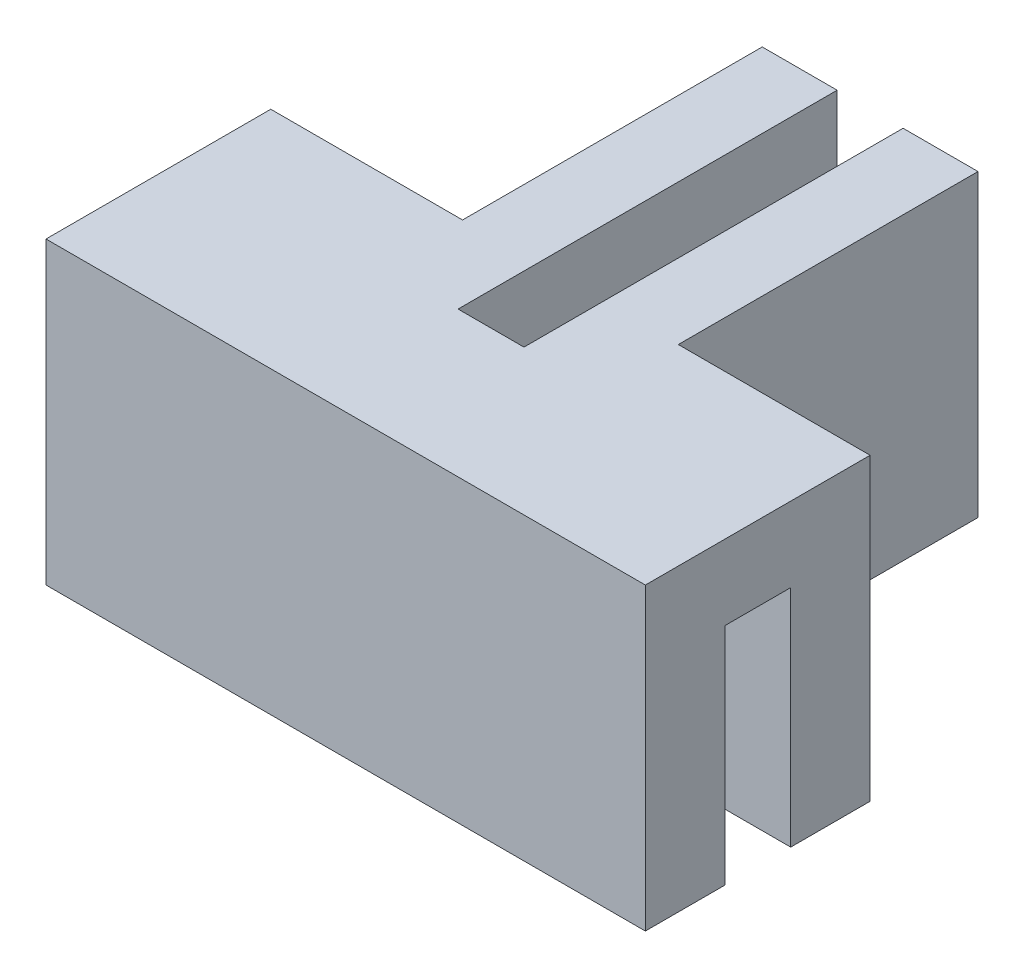
ISO-10303-21;
HEADER;
FILE_DESCRIPTION(('STEP AP214'),'2;1');
FILE_NAME('part.step','',(''),(''),'','','');
FILE_SCHEMA(('AUTOMOTIVE_DESIGN { 1 0 10303 214 1 1 1 1 }'));
ENDSEC;
DATA;
#1=APPLICATION_CONTEXT('core data for automotive mechanical design processes');
#2=APPLICATION_PROTOCOL_DEFINITION('international standard','automotive_design',2000,#1);
#3=PRODUCT_CONTEXT('',#1,'mechanical');
#4=PRODUCT('Part','Part','',(#3));
#5=PRODUCT_RELATED_PRODUCT_CATEGORY('part','',(#4));
#6=PRODUCT_DEFINITION_FORMATION('','',#4);
#7=PRODUCT_DEFINITION_CONTEXT('part definition',#1,'design');
#8=PRODUCT_DEFINITION('design','',#6,#7);
#9=PRODUCT_DEFINITION_SHAPE('','',#8);
#10=(LENGTH_UNIT() NAMED_UNIT(*) SI_UNIT(.MILLI.,.METRE.));
#11=(NAMED_UNIT(*) PLANE_ANGLE_UNIT() SI_UNIT($,.RADIAN.));
#12=(NAMED_UNIT(*) SI_UNIT($,.STERADIAN.) SOLID_ANGLE_UNIT());
#13=UNCERTAINTY_MEASURE_WITH_UNIT(LENGTH_MEASURE(1.E-05),#10,'distance_accuracy_value','');
#14=(GEOMETRIC_REPRESENTATION_CONTEXT(3) GLOBAL_UNCERTAINTY_ASSIGNED_CONTEXT((#13)) GLOBAL_UNIT_ASSIGNED_CONTEXT((#10,
#11,#12)) REPRESENTATION_CONTEXT('',''));
#15=CARTESIAN_POINT('',(0.,0.,0.));
#16=DIRECTION('',(0.,0.,1.));
#17=DIRECTION('',(1.,0.,0.));
#18=AXIS2_PLACEMENT_3D('',#15,#16,#17);
#19=CARTESIAN_POINT('',(0.,12.7,3.3655));
#20=DIRECTION('',(0.,0.,-1.));
#21=DIRECTION('',(-1.,0.,0.));
#22=AXIS2_PLACEMENT_3D('',#19,#20,#21);
#23=PLANE('',#22);
#24=DIRECTION('',(0.,-1.,0.));
#25=VECTOR('',#24,1.);
#26=CARTESIAN_POINT('',(1.397,12.7,3.3655));
#27=LINE('',#26,#25);
#28=CARTESIAN_POINT('',(1.397,12.7,3.3655));
#29=VERTEX_POINT('',#28);
#30=CARTESIAN_POINT('',(1.397,9.525,3.3655));
#31=VERTEX_POINT('',#30);
#32=EDGE_CURVE('E234',#29,#31,#27,.T.);
#33=ORIENTED_EDGE('',*,*,#32,.T.);
#34=DIRECTION('',(1.,0.,0.));
#35=VECTOR('',#34,1.);
#36=CARTESIAN_POINT('',(-12.7,9.525,3.3655));
#37=LINE('',#36,#35);
#38=CARTESIAN_POINT('',(-1.397,9.525,3.3655));
#39=VERTEX_POINT('',#38);
#40=EDGE_CURVE('E395',#39,#31,#37,.T.);
#41=ORIENTED_EDGE('',*,*,#40,.F.);
#42=DIRECTION('',(0.,-1.,0.));
#43=VECTOR('',#42,1.);
#44=CARTESIAN_POINT('',(-1.397,12.7,3.3655));
#45=LINE('',#44,#43);
#46=CARTESIAN_POINT('',(-1.397,12.7,3.3655));
#47=VERTEX_POINT('',#46);
#48=EDGE_CURVE('E230',#47,#39,#45,.T.);
#49=ORIENTED_EDGE('',*,*,#48,.F.);
#50=DIRECTION('',(1.,0.,0.));
#51=VECTOR('',#50,1.);
#52=CARTESIAN_POINT('',(0.,12.7,3.3655));
#53=LINE('',#52,#51);
#54=EDGE_CURVE('E343',#47,#29,#53,.T.);
#55=ORIENTED_EDGE('',*,*,#54,.T.);
#56=EDGE_LOOP('',(#33,#41,#49,#55));
#57=FACE_BOUND('',#56,.T.);
#58=ADVANCED_FACE('F41',(#57),#23,.T.);
#59=CARTESIAN_POINT('',(0.,0.,0.));
#60=DIRECTION('',(0.,1.,0.));
#61=DIRECTION('',(0.,0.,1.));
#62=AXIS2_PLACEMENT_3D('',#59,#60,#61);
#63=PLANE('',#62);
#64=DIRECTION('',(0.,0.,1.));
#65=VECTOR('',#64,1.);
#66=CARTESIAN_POINT('',(-12.7,0.,0.));
#67=LINE('',#66,#65);
#68=CARTESIAN_POINT('',(-12.7,0.,6.1595));
#69=VERTEX_POINT('',#68);
#70=CARTESIAN_POINT('',(-12.7,0.,9.525));
#71=VERTEX_POINT('',#70);
#72=EDGE_CURVE('E158',#69,#71,#67,.T.);
#73=ORIENTED_EDGE('',*,*,#72,.F.);
#74=DIRECTION('',(-1.,0.,0.));
#75=VECTOR('',#74,1.);
#76=CARTESIAN_POINT('',(-12.7,0.,6.1595));
#77=LINE('',#76,#75);
#78=CARTESIAN_POINT('',(12.7,0.,6.1595));
#79=VERTEX_POINT('',#78);
#80=EDGE_CURVE('E368',#79,#69,#77,.T.);
#81=ORIENTED_EDGE('',*,*,#80,.F.);
#82=DIRECTION('',(0.,0.,1.));
#83=VECTOR('',#82,1.);
#84=CARTESIAN_POINT('',(12.7,0.,0.));
#85=LINE('',#84,#83);
#86=CARTESIAN_POINT('',(12.7,0.,9.525));
#87=VERTEX_POINT('',#86);
#88=EDGE_CURVE('E209',#79,#87,#85,.T.);
#89=ORIENTED_EDGE('',*,*,#88,.T.);
#90=DIRECTION('',(1.,0.,0.));
#91=VECTOR('',#90,1.);
#92=CARTESIAN_POINT('',(0.,0.,9.525));
#93=LINE('',#92,#91);
#94=EDGE_CURVE('E206',#71,#87,#93,.T.);
#95=ORIENTED_EDGE('',*,*,#94,.F.);
#96=EDGE_LOOP('',(#73,#81,#89,#95));
#97=FACE_BOUND('',#96,.T.);
#98=ADVANCED_FACE('F263',(#97),#63,.F.);
#99=CARTESIAN_POINT('',(12.7,0.,0.));
#100=VERTEX_POINT('',#99);
#101=CARTESIAN_POINT('',(12.7,0.,3.36550000000001));
#102=VERTEX_POINT('',#101);
#103=EDGE_CURVE('E210',#100,#102,#85,.T.);
#104=ORIENTED_EDGE('',*,*,#103,.T.);
#105=DIRECTION('',(-1.,0.,0.));
#106=VECTOR('',#105,1.);
#107=CARTESIAN_POINT('',(0.,0.,3.3655));
#108=LINE('',#107,#106);
#109=CARTESIAN_POINT('',(1.397,0.,3.3655));
#110=VERTEX_POINT('',#109);
#111=EDGE_CURVE('E11',#102,#110,#108,.T.);
#112=ORIENTED_EDGE('',*,*,#111,.T.);
#113=DIRECTION('',(0.,0.,1.));
#114=VECTOR('',#113,1.);
#115=CARTESIAN_POINT('',(1.397,0.,0.));
#116=LINE('',#115,#114);
#117=CARTESIAN_POINT('',(1.397,0.,-12.7));
#118=VERTEX_POINT('',#117);
#119=EDGE_CURVE('E186',#118,#110,#116,.T.);
#120=ORIENTED_EDGE('',*,*,#119,.F.);
#121=DIRECTION('',(-1.,0.,0.));
#122=VECTOR('',#121,1.);
#123=CARTESIAN_POINT('',(0.,0.,-12.7));
#124=LINE('',#123,#122);
#125=CARTESIAN_POINT('',(4.572,0.,-12.7));
#126=VERTEX_POINT('',#125);
#127=EDGE_CURVE('E183',#126,#118,#124,.T.);
#128=ORIENTED_EDGE('',*,*,#127,.F.);
#129=DIRECTION('',(0.,0.,-1.));
#130=VECTOR('',#129,1.);
#131=CARTESIAN_POINT('',(4.572,0.,0.));
#132=LINE('',#131,#130);
#133=CARTESIAN_POINT('',(4.572,0.,0.));
#134=VERTEX_POINT('',#133);
#135=EDGE_CURVE('E178',#134,#126,#132,.T.);
#136=ORIENTED_EDGE('',*,*,#135,.F.);
#137=DIRECTION('',(1.,0.,0.));
#138=VECTOR('',#137,1.);
#139=CARTESIAN_POINT('',(0.,0.,0.));
#140=LINE('',#139,#138);
#141=EDGE_CURVE('E175',#134,#100,#140,.T.);
#142=ORIENTED_EDGE('',*,*,#141,.T.);
#143=EDGE_LOOP('',(#104,#112,#120,#128,#136,#142));
#144=FACE_BOUND('',#143,.T.);
#145=ADVANCED_FACE('F252',(#144),#63,.F.);
#146=CARTESIAN_POINT('',(0.,12.7,0.));
#147=DIRECTION('',(0.,0.,-1.));
#148=DIRECTION('',(-1.,0.,0.));
#149=AXIS2_PLACEMENT_3D('',#146,#147,#148);
#150=PLANE('',#149);
#151=ORIENTED_EDGE('',*,*,#141,.F.);
#152=DIRECTION('',(0.,-1.,0.));
#153=VECTOR('',#152,1.);
#154=CARTESIAN_POINT('',(4.572,12.7,0.));
#155=LINE('',#154,#153);
#156=CARTESIAN_POINT('',(4.572,12.7,0.));
#157=VERTEX_POINT('',#156);
#158=EDGE_CURVE('E50',#157,#134,#155,.T.);
#159=ORIENTED_EDGE('',*,*,#158,.F.);
#160=DIRECTION('',(1.,0.,0.));
#161=VECTOR('',#160,1.);
#162=CARTESIAN_POINT('',(0.,12.7,0.));
#163=LINE('',#162,#161);
#164=CARTESIAN_POINT('',(12.7,12.7,0.));
#165=VERTEX_POINT('',#164);
#166=EDGE_CURVE('E214',#157,#165,#163,.T.);
#167=ORIENTED_EDGE('',*,*,#166,.T.);
#168=DIRECTION('',(0.,-1.,0.));
#169=VECTOR('',#168,1.);
#170=CARTESIAN_POINT('',(12.7,12.7,0.));
#171=LINE('',#170,#169);
#172=EDGE_CURVE('E66',#165,#100,#171,.T.);
#173=ORIENTED_EDGE('',*,*,#172,.T.);
#174=EDGE_LOOP('',(#151,#159,#167,#173));
#175=FACE_BOUND('',#174,.T.);
#176=ADVANCED_FACE('F254',(#175),#150,.T.);
#177=CARTESIAN_POINT('',(4.572,12.7,0.));
#178=DIRECTION('',(-1.,0.,0.));
#179=DIRECTION('',(0.,0.,1.));
#180=AXIS2_PLACEMENT_3D('',#177,#178,#179);
#181=PLANE('',#180);
#182=ORIENTED_EDGE('',*,*,#135,.T.);
#183=DIRECTION('',(0.,-1.,0.));
#184=VECTOR('',#183,1.);
#185=CARTESIAN_POINT('',(4.572,12.7,-12.7));
#186=LINE('',#185,#184);
#187=CARTESIAN_POINT('',(4.572,12.7,-12.7));
#188=VERTEX_POINT('',#187);
#189=EDGE_CURVE('E242',#188,#126,#186,.T.);
#190=ORIENTED_EDGE('',*,*,#189,.F.);
#191=DIRECTION('',(0.,0.,-1.));
#192=VECTOR('',#191,1.);
#193=CARTESIAN_POINT('',(4.572,12.7,0.));
#194=LINE('',#193,#192);
#195=EDGE_CURVE('E249',#157,#188,#194,.T.);
#196=ORIENTED_EDGE('',*,*,#195,.F.);
#197=ORIENTED_EDGE('',*,*,#158,.T.);
#198=EDGE_LOOP('',(#182,#190,#196,#197));
#199=FACE_BOUND('',#198,.T.);
#200=ADVANCED_FACE('F43',(#199),#181,.F.);
#201=CARTESIAN_POINT('',(0.,12.7,-12.7));
#202=DIRECTION('',(0.,0.,1.));
#203=DIRECTION('',(1.,0.,0.));
#204=AXIS2_PLACEMENT_3D('',#201,#202,#203);
#205=PLANE('',#204);
#206=ORIENTED_EDGE('',*,*,#127,.T.);
#207=DIRECTION('',(0.,-1.,0.));
#208=VECTOR('',#207,1.);
#209=CARTESIAN_POINT('',(1.397,12.7,-12.7));
#210=LINE('',#209,#208);
#211=CARTESIAN_POINT('',(1.397,12.7,-12.7));
#212=VERTEX_POINT('',#211);
#213=EDGE_CURVE('E238',#212,#118,#210,.T.);
#214=ORIENTED_EDGE('',*,*,#213,.F.);
#215=DIRECTION('',(-1.,0.,0.));
#216=VECTOR('',#215,1.);
#217=CARTESIAN_POINT('',(0.,12.7,-12.7));
#218=LINE('',#217,#216);
#219=EDGE_CURVE('E338',#188,#212,#218,.T.);
#220=ORIENTED_EDGE('',*,*,#219,.F.);
#221=ORIENTED_EDGE('',*,*,#189,.T.);
#222=EDGE_LOOP('',(#206,#214,#220,#221));
#223=FACE_BOUND('',#222,.T.);
#224=ADVANCED_FACE('F262',(#223),#205,.F.);
#225=CARTESIAN_POINT('',(1.397,12.7,0.));
#226=DIRECTION('',(1.,0.,0.));
#227=DIRECTION('',(0.,0.,-1.));
#228=AXIS2_PLACEMENT_3D('',#225,#226,#227);
#229=PLANE('',#228);
#230=ORIENTED_EDGE('',*,*,#119,.T.);
#231=DIRECTION('',(0.,1.,0.));
#232=VECTOR('',#231,1.);
#233=CARTESIAN_POINT('',(1.397,12.7,3.3655));
#234=LINE('',#233,#232);
#235=EDGE_CURVE('E179',#110,#31,#234,.T.);
#236=ORIENTED_EDGE('',*,*,#235,.T.);
#237=ORIENTED_EDGE('',*,*,#32,.F.);
#238=DIRECTION('',(0.,0.,1.));
#239=VECTOR('',#238,1.);
#240=CARTESIAN_POINT('',(1.397,12.7,0.));
#241=LINE('',#240,#239);
#242=EDGE_CURVE('E295',#212,#29,#241,.T.);
#243=ORIENTED_EDGE('',*,*,#242,.F.);
#244=ORIENTED_EDGE('',*,*,#213,.T.);
#245=EDGE_LOOP('',(#230,#236,#237,#243,#244));
#246=FACE_BOUND('',#245,.T.);
#247=ADVANCED_FACE('F282',(#246),#229,.F.);
#248=CARTESIAN_POINT('',(-1.397,12.7,0.));
#249=DIRECTION('',(1.,0.,0.));
#250=DIRECTION('',(0.,0.,-1.));
#251=AXIS2_PLACEMENT_3D('',#248,#249,#250);
#252=PLANE('',#251);
#253=DIRECTION('',(0.,0.,1.));
#254=VECTOR('',#253,1.);
#255=CARTESIAN_POINT('',(-1.397,0.,0.));
#256=LINE('',#255,#254);
#257=CARTESIAN_POINT('',(-1.397,0.,-12.7));
#258=VERTEX_POINT('',#257);
#259=CARTESIAN_POINT('',(-1.397,0.,3.3655));
#260=VERTEX_POINT('',#259);
#261=EDGE_CURVE('E190',#258,#260,#256,.T.);
#262=ORIENTED_EDGE('',*,*,#261,.F.);
#263=DIRECTION('',(0.,-1.,0.));
#264=VECTOR('',#263,1.);
#265=CARTESIAN_POINT('',(-1.397,12.7,-12.7));
#266=LINE('',#265,#264);
#267=CARTESIAN_POINT('',(-1.397,12.7,-12.7));
#268=VERTEX_POINT('',#267);
#269=EDGE_CURVE('E227',#268,#258,#266,.T.);
#270=ORIENTED_EDGE('',*,*,#269,.F.);
#271=DIRECTION('',(0.,0.,1.));
#272=VECTOR('',#271,1.);
#273=CARTESIAN_POINT('',(-1.397,12.7,0.));
#274=LINE('',#273,#272);
#275=EDGE_CURVE('E347',#268,#47,#274,.T.);
#276=ORIENTED_EDGE('',*,*,#275,.T.);
#277=ORIENTED_EDGE('',*,*,#48,.T.);
#278=DIRECTION('',(0.,1.,0.));
#279=VECTOR('',#278,1.);
#280=CARTESIAN_POINT('',(-1.397,12.7,3.3655));
#281=LINE('',#280,#279);
#282=EDGE_CURVE('E328',#260,#39,#281,.T.);
#283=ORIENTED_EDGE('',*,*,#282,.F.);
#284=EDGE_LOOP('',(#262,#270,#276,#277,#283));
#285=FACE_BOUND('',#284,.T.);
#286=ADVANCED_FACE('F280',(#285),#252,.T.);
#287=CARTESIAN_POINT('',(0.,12.7,-12.7));
#288=DIRECTION('',(0.,0.,-1.));
#289=DIRECTION('',(-1.,0.,0.));
#290=AXIS2_PLACEMENT_3D('',#287,#288,#289);
#291=PLANE('',#290);
#292=DIRECTION('',(1.,0.,0.));
#293=VECTOR('',#292,1.);
#294=CARTESIAN_POINT('',(0.,0.,-12.7));
#295=LINE('',#294,#293);
#296=CARTESIAN_POINT('',(-4.572,0.,-12.7));
#297=VERTEX_POINT('',#296);
#298=EDGE_CURVE('E194',#297,#258,#295,.T.);
#299=ORIENTED_EDGE('',*,*,#298,.F.);
#300=DIRECTION('',(0.,-1.,0.));
#301=VECTOR('',#300,1.);
#302=CARTESIAN_POINT('',(-4.572,12.7,-12.7));
#303=LINE('',#302,#301);
#304=CARTESIAN_POINT('',(-4.572,12.7,-12.7));
#305=VERTEX_POINT('',#304);
#306=EDGE_CURVE('E224',#305,#297,#303,.T.);
#307=ORIENTED_EDGE('',*,*,#306,.F.);
#308=DIRECTION('',(1.,0.,0.));
#309=VECTOR('',#308,1.);
#310=CARTESIAN_POINT('',(0.,12.7,-12.7));
#311=LINE('',#310,#309);
#312=EDGE_CURVE('E351',#305,#268,#311,.T.);
#313=ORIENTED_EDGE('',*,*,#312,.T.);
#314=ORIENTED_EDGE('',*,*,#269,.T.);
#315=EDGE_LOOP('',(#299,#307,#313,#314));
#316=FACE_BOUND('',#315,.T.);
#317=ADVANCED_FACE('F514',(#316),#291,.T.);
#318=CARTESIAN_POINT('',(-4.572,12.7,0.));
#319=DIRECTION('',(-1.,0.,0.));
#320=DIRECTION('',(0.,0.,1.));
#321=AXIS2_PLACEMENT_3D('',#318,#319,#320);
#322=PLANE('',#321);
#323=DIRECTION('',(0.,0.,-1.));
#324=VECTOR('',#323,1.);
#325=CARTESIAN_POINT('',(-4.572,0.,0.));
#326=LINE('',#325,#324);
#327=CARTESIAN_POINT('',(-4.572,0.,0.));
#328=VERTEX_POINT('',#327);
#329=EDGE_CURVE('E198',#328,#297,#326,.T.);
#330=ORIENTED_EDGE('',*,*,#329,.F.);
#331=DIRECTION('',(0.,-1.,0.));
#332=VECTOR('',#331,1.);
#333=CARTESIAN_POINT('',(-4.572,12.7,0.));
#334=LINE('',#333,#332);
#335=CARTESIAN_POINT('',(-4.572,12.7,0.));
#336=VERTEX_POINT('',#335);
#337=EDGE_CURVE('E221',#336,#328,#334,.T.);
#338=ORIENTED_EDGE('',*,*,#337,.F.);
#339=DIRECTION('',(0.,0.,-1.));
#340=VECTOR('',#339,1.);
#341=CARTESIAN_POINT('',(-4.572,12.7,0.));
#342=LINE('',#341,#340);
#343=EDGE_CURVE('E354',#336,#305,#342,.T.);
#344=ORIENTED_EDGE('',*,*,#343,.T.);
#345=ORIENTED_EDGE('',*,*,#306,.T.);
#346=EDGE_LOOP('',(#330,#338,#344,#345));
#347=FACE_BOUND('',#346,.T.);
#348=ADVANCED_FACE('F269',(#347),#322,.T.);
#349=CARTESIAN_POINT('',(-12.7,0.,0.));
#350=VERTEX_POINT('',#349);
#351=EDGE_CURVE('E180',#350,#328,#140,.T.);
#352=ORIENTED_EDGE('',*,*,#351,.F.);
#353=DIRECTION('',(0.,-1.,0.));
#354=VECTOR('',#353,1.);
#355=CARTESIAN_POINT('',(-12.7,12.7,0.));
#356=LINE('',#355,#354);
#357=CARTESIAN_POINT('',(-12.7,12.7,0.));
#358=VERTEX_POINT('',#357);
#359=EDGE_CURVE('E163',#358,#350,#356,.T.);
#360=ORIENTED_EDGE('',*,*,#359,.F.);
#361=EDGE_CURVE('E148',#358,#336,#163,.T.);
#362=ORIENTED_EDGE('',*,*,#361,.T.);
#363=ORIENTED_EDGE('',*,*,#337,.T.);
#364=EDGE_LOOP('',(#352,#360,#362,#363));
#365=FACE_BOUND('',#364,.T.);
#366=ADVANCED_FACE('F257',(#365),#150,.T.);
#367=CARTESIAN_POINT('',(-12.7,12.7,0.));
#368=DIRECTION('',(1.,0.,0.));
#369=DIRECTION('',(0.,0.,-1.));
#370=AXIS2_PLACEMENT_3D('',#367,#368,#369);
#371=PLANE('',#370);
#372=DIRECTION('',(0.,0.,-1.));
#373=VECTOR('',#372,1.);
#374=CARTESIAN_POINT('',(-12.7,9.525,6.1595));
#375=LINE('',#374,#373);
#376=CARTESIAN_POINT('',(-12.7,9.525,6.1595));
#377=VERTEX_POINT('',#376);
#378=CARTESIAN_POINT('',(-12.7,9.525,3.3655));
#379=VERTEX_POINT('',#378);
#380=EDGE_CURVE('E372',#377,#379,#375,.T.);
#381=ORIENTED_EDGE('',*,*,#380,.F.);
#382=DIRECTION('',(0.,-1.,0.));
#383=VECTOR('',#382,1.);
#384=CARTESIAN_POINT('',(-12.7,9.525,6.1595));
#385=LINE('',#384,#383);
#386=EDGE_CURVE('E322',#377,#69,#385,.T.);
#387=ORIENTED_EDGE('',*,*,#386,.T.);
#388=ORIENTED_EDGE('',*,*,#72,.T.);
#389=DIRECTION('',(0.,-1.,0.));
#390=VECTOR('',#389,1.);
#391=CARTESIAN_POINT('',(-12.7,12.7,9.525));
#392=LINE('',#391,#390);
#393=CARTESIAN_POINT('',(-12.7,12.7,9.525));
#394=VERTEX_POINT('',#393);
#395=EDGE_CURVE('E153',#394,#71,#392,.T.);
#396=ORIENTED_EDGE('',*,*,#395,.F.);
#397=DIRECTION('',(0.,0.,1.));
#398=VECTOR('',#397,1.);
#399=CARTESIAN_POINT('',(-12.7,12.7,0.));
#400=LINE('',#399,#398);
#401=EDGE_CURVE('E138',#358,#394,#400,.T.);
#402=ORIENTED_EDGE('',*,*,#401,.F.);
#403=ORIENTED_EDGE('',*,*,#359,.T.);
#404=CARTESIAN_POINT('',(-12.7,0.,3.3655));
#405=VERTEX_POINT('',#404);
#406=EDGE_CURVE('E202',#350,#405,#67,.T.);
#407=ORIENTED_EDGE('',*,*,#406,.T.);
#408=DIRECTION('',(0.,-1.,0.));
#409=VECTOR('',#408,1.);
#410=CARTESIAN_POINT('',(-12.7,9.525,3.3655));
#411=LINE('',#410,#409);
#412=EDGE_CURVE('E57',#379,#405,#411,.T.);
#413=ORIENTED_EDGE('',*,*,#412,.F.);
#414=EDGE_LOOP('',(#381,#387,#388,#396,#402,#403,#407,#413));
#415=FACE_BOUND('',#414,.T.);
#416=ADVANCED_FACE('F155',(#415),#371,.F.);
#417=CARTESIAN_POINT('',(0.,12.7,9.525));
#418=DIRECTION('',(0.,0.,-1.));
#419=DIRECTION('',(-1.,0.,0.));
#420=AXIS2_PLACEMENT_3D('',#417,#418,#419);
#421=PLANE('',#420);
#422=ORIENTED_EDGE('',*,*,#94,.T.);
#423=DIRECTION('',(0.,-1.,0.));
#424=VECTOR('',#423,1.);
#425=CARTESIAN_POINT('',(12.7,12.7,9.525));
#426=LINE('',#425,#424);
#427=CARTESIAN_POINT('',(12.7,12.7,9.525));
#428=VERTEX_POINT('',#427);
#429=EDGE_CURVE('E164',#428,#87,#426,.T.);
#430=ORIENTED_EDGE('',*,*,#429,.F.);
#431=DIRECTION('',(1.,0.,0.));
#432=VECTOR('',#431,1.);
#433=CARTESIAN_POINT('',(0.,12.7,9.525));
#434=LINE('',#433,#432);
#435=EDGE_CURVE('E144',#394,#428,#434,.T.);
#436=ORIENTED_EDGE('',*,*,#435,.F.);
#437=ORIENTED_EDGE('',*,*,#395,.T.);
#438=EDGE_LOOP('',(#422,#430,#436,#437));
#439=FACE_BOUND('',#438,.T.);
#440=ADVANCED_FACE('F166',(#439),#421,.F.);
#441=CARTESIAN_POINT('',(12.7,12.7,0.));
#442=DIRECTION('',(1.,0.,0.));
#443=DIRECTION('',(0.,0.,-1.));
#444=AXIS2_PLACEMENT_3D('',#441,#442,#443);
#445=PLANE('',#444);
#446=DIRECTION('',(0.,-1.,0.));
#447=VECTOR('',#446,1.);
#448=CARTESIAN_POINT('',(12.7,9.525,6.1595));
#449=LINE('',#448,#447);
#450=CARTESIAN_POINT('',(12.7,9.525,6.1595));
#451=VERTEX_POINT('',#450);
#452=EDGE_CURVE('E317',#451,#79,#449,.T.);
#453=ORIENTED_EDGE('',*,*,#452,.F.);
#454=DIRECTION('',(0.,0.,1.));
#455=VECTOR('',#454,1.);
#456=CARTESIAN_POINT('',(12.7,9.525,6.1595));
#457=LINE('',#456,#455);
#458=CARTESIAN_POINT('',(12.7,9.525,3.36550000000001));
#459=VERTEX_POINT('',#458);
#460=EDGE_CURVE('E315',#459,#451,#457,.T.);
#461=ORIENTED_EDGE('',*,*,#460,.F.);
#462=DIRECTION('',(0.,-1.,0.));
#463=VECTOR('',#462,1.);
#464=CARTESIAN_POINT('',(12.7,9.525,3.36550000000001));
#465=LINE('',#464,#463);
#466=EDGE_CURVE('E308',#459,#102,#465,.T.);
#467=ORIENTED_EDGE('',*,*,#466,.T.);
#468=ORIENTED_EDGE('',*,*,#103,.F.);
#469=ORIENTED_EDGE('',*,*,#172,.F.);
#470=DIRECTION('',(0.,0.,1.));
#471=VECTOR('',#470,1.);
#472=CARTESIAN_POINT('',(12.7,12.7,0.));
#473=LINE('',#472,#471);
#474=EDGE_CURVE('E169',#165,#428,#473,.T.);
#475=ORIENTED_EDGE('',*,*,#474,.T.);
#476=ORIENTED_EDGE('',*,*,#429,.T.);
#477=ORIENTED_EDGE('',*,*,#88,.F.);
#478=EDGE_LOOP('',(#453,#461,#467,#468,#469,#475,#476,#477));
#479=FACE_BOUND('',#478,.T.);
#480=ADVANCED_FACE('F313',(#479),#445,.T.);
#481=CARTESIAN_POINT('',(0.,12.7,0.));
#482=DIRECTION('',(0.,1.,0.));
#483=DIRECTION('',(0.,0.,1.));
#484=AXIS2_PLACEMENT_3D('',#481,#482,#483);
#485=PLANE('',#484);
#486=ORIENTED_EDGE('',*,*,#166,.F.);
#487=ORIENTED_EDGE('',*,*,#195,.T.);
#488=ORIENTED_EDGE('',*,*,#219,.T.);
#489=ORIENTED_EDGE('',*,*,#242,.T.);
#490=ORIENTED_EDGE('',*,*,#54,.F.);
#491=ORIENTED_EDGE('',*,*,#275,.F.);
#492=ORIENTED_EDGE('',*,*,#312,.F.);
#493=ORIENTED_EDGE('',*,*,#343,.F.);
#494=ORIENTED_EDGE('',*,*,#361,.F.);
#495=ORIENTED_EDGE('',*,*,#401,.T.);
#496=ORIENTED_EDGE('',*,*,#435,.T.);
#497=ORIENTED_EDGE('',*,*,#474,.F.);
#498=EDGE_LOOP('',(#486,#487,#488,#489,#490,#491,#492,#493,#494,#495,#496,#497));
#499=FACE_BOUND('',#498,.T.);
#500=ADVANCED_FACE('F141',(#499),#485,.T.);
#501=ORIENTED_EDGE('',*,*,#261,.T.);
#502=DIRECTION('',(1.,0.,0.));
#503=VECTOR('',#502,1.);
#504=CARTESIAN_POINT('',(-12.7,0.,3.3655));
#505=LINE('',#504,#503);
#506=EDGE_CURVE('E364',#405,#260,#505,.T.);
#507=ORIENTED_EDGE('',*,*,#506,.F.);
#508=ORIENTED_EDGE('',*,*,#406,.F.);
#509=ORIENTED_EDGE('',*,*,#351,.T.);
#510=ORIENTED_EDGE('',*,*,#329,.T.);
#511=ORIENTED_EDGE('',*,*,#298,.T.);
#512=EDGE_LOOP('',(#501,#507,#508,#509,#510,#511));
#513=FACE_BOUND('',#512,.T.);
#514=ADVANCED_FACE('F265',(#513),#63,.F.);
#515=CARTESIAN_POINT('',(-12.7,9.525,3.3655));
#516=DIRECTION('',(0.,0.,-1.));
#517=DIRECTION('',(-1.,0.,0.));
#518=AXIS2_PLACEMENT_3D('',#515,#516,#517);
#519=PLANE('',#518);
#520=ORIENTED_EDGE('',*,*,#111,.F.);
#521=ORIENTED_EDGE('',*,*,#466,.F.);
#522=EDGE_CURVE('E411',#31,#459,#37,.T.);
#523=ORIENTED_EDGE('',*,*,#522,.F.);
#524=ORIENTED_EDGE('',*,*,#235,.F.);
#525=EDGE_LOOP('',(#520,#521,#523,#524));
#526=FACE_BOUND('',#525,.T.);
#527=ADVANCED_FACE('F305',(#526),#519,.F.);
#528=CARTESIAN_POINT('',(-12.7,9.525,6.1595));
#529=DIRECTION('',(0.,0.,1.));
#530=DIRECTION('',(1.,0.,0.));
#531=AXIS2_PLACEMENT_3D('',#528,#529,#530);
#532=PLANE('',#531);
#533=ORIENTED_EDGE('',*,*,#80,.T.);
#534=ORIENTED_EDGE('',*,*,#386,.F.);
#535=DIRECTION('',(-1.,0.,0.));
#536=VECTOR('',#535,1.);
#537=CARTESIAN_POINT('',(-12.7,9.525,6.1595));
#538=LINE('',#537,#536);
#539=EDGE_CURVE('E324',#451,#377,#538,.T.);
#540=ORIENTED_EDGE('',*,*,#539,.F.);
#541=ORIENTED_EDGE('',*,*,#452,.T.);
#542=EDGE_LOOP('',(#533,#534,#540,#541));
#543=FACE_BOUND('',#542,.T.);
#544=ADVANCED_FACE('F418',(#543),#532,.F.);
#545=ORIENTED_EDGE('',*,*,#282,.T.);
#546=EDGE_CURVE('E406',#379,#39,#37,.T.);
#547=ORIENTED_EDGE('',*,*,#546,.F.);
#548=ORIENTED_EDGE('',*,*,#412,.T.);
#549=ORIENTED_EDGE('',*,*,#506,.T.);
#550=EDGE_LOOP('',(#545,#547,#548,#549));
#551=FACE_BOUND('',#550,.T.);
#552=ADVANCED_FACE('F407',(#551),#519,.F.);
#553=CARTESIAN_POINT('',(0.,9.525,0.));
#554=DIRECTION('',(0.,-1.,0.));
#555=DIRECTION('',(0.,0.,-1.));
#556=AXIS2_PLACEMENT_3D('',#553,#554,#555);
#557=PLANE('',#556);
#558=ORIENTED_EDGE('',*,*,#380,.T.);
#559=ORIENTED_EDGE('',*,*,#546,.T.);
#560=ORIENTED_EDGE('',*,*,#40,.T.);
#561=ORIENTED_EDGE('',*,*,#522,.T.);
#562=ORIENTED_EDGE('',*,*,#460,.T.);
#563=ORIENTED_EDGE('',*,*,#539,.T.);
#564=EDGE_LOOP('',(#558,#559,#560,#561,#562,#563));
#565=FACE_BOUND('',#564,.T.);
#566=ADVANCED_FACE('F412',(#565),#557,.T.);
#567=CLOSED_SHELL('',(#58,#98,#145,#176,#200,#224,#247,#286,#317,#348,#366,#416,#440,#480,#500,
#514,#527,#544,#552,#566));
#568=MANIFOLD_SOLID_BREP('B2',#567);
#569=ADVANCED_BREP_SHAPE_REPRESENTATION('',(#18,#568),#14);
#570=SHAPE_DEFINITION_REPRESENTATION(#9,#569);
ENDSEC;
END-ISO-10303-21;
